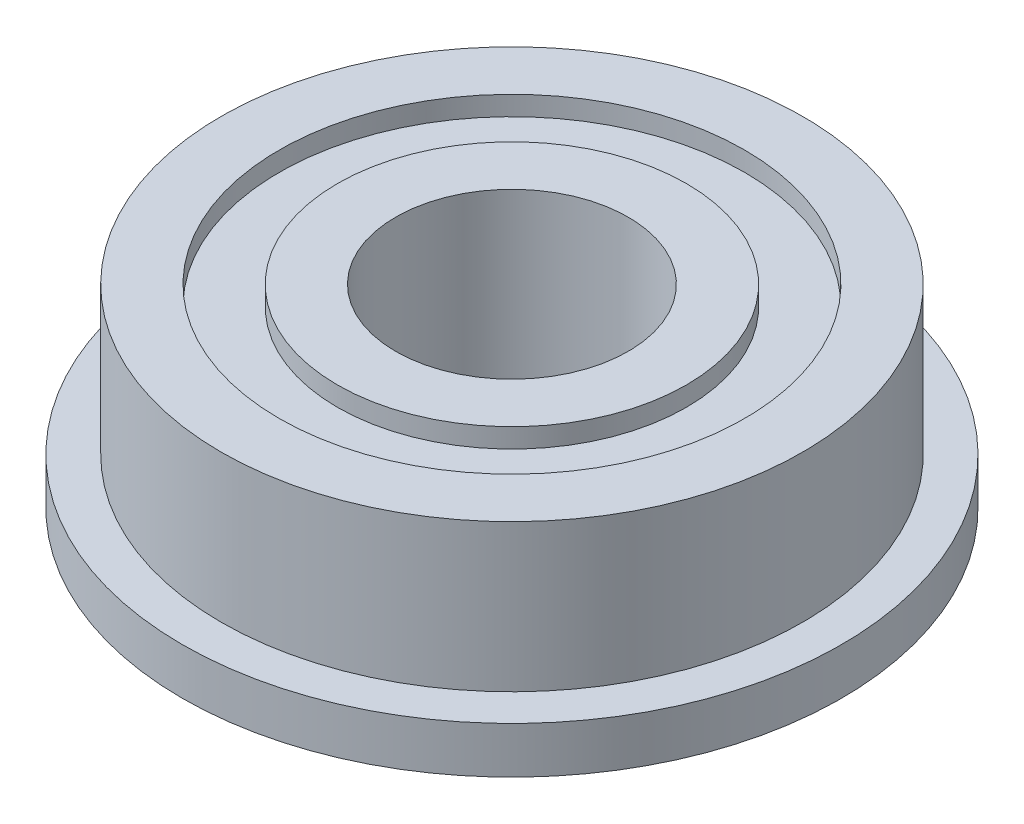
ISO-10303-21;
HEADER;
FILE_DESCRIPTION(('STEP AP214'),'2;1');
FILE_NAME('part.step','',(''),(''),'','','');
FILE_SCHEMA(('AUTOMOTIVE_DESIGN { 1 0 10303 214 1 1 1 1 }'));
ENDSEC;
DATA;
#1=APPLICATION_CONTEXT('core data for automotive mechanical design processes');
#2=APPLICATION_PROTOCOL_DEFINITION('international standard','automotive_design',2000,#1);
#3=PRODUCT_CONTEXT('',#1,'mechanical');
#4=PRODUCT('Part','Part','',(#3));
#5=PRODUCT_RELATED_PRODUCT_CATEGORY('part','',(#4));
#6=PRODUCT_DEFINITION_FORMATION('','',#4);
#7=PRODUCT_DEFINITION_CONTEXT('part definition',#1,'design');
#8=PRODUCT_DEFINITION('design','',#6,#7);
#9=PRODUCT_DEFINITION_SHAPE('','',#8);
#10=(LENGTH_UNIT() NAMED_UNIT(*) SI_UNIT(.MILLI.,.METRE.));
#11=(NAMED_UNIT(*) PLANE_ANGLE_UNIT() SI_UNIT($,.RADIAN.));
#12=(NAMED_UNIT(*) SI_UNIT($,.STERADIAN.) SOLID_ANGLE_UNIT());
#13=UNCERTAINTY_MEASURE_WITH_UNIT(LENGTH_MEASURE(1.E-05),#10,'distance_accuracy_value','');
#14=(GEOMETRIC_REPRESENTATION_CONTEXT(3) GLOBAL_UNCERTAINTY_ASSIGNED_CONTEXT((#13)) GLOBAL_UNIT_ASSIGNED_CONTEXT((#10,
#11,#12)) REPRESENTATION_CONTEXT('',''));
#15=CARTESIAN_POINT('',(0.,0.,0.));
#16=DIRECTION('',(0.,0.,1.));
#17=DIRECTION('',(1.,0.,0.));
#18=AXIS2_PLACEMENT_3D('',#15,#16,#17);
#19=CARTESIAN_POINT('',(4.5,0.,0.));
#20=DIRECTION('',(0.,1.,0.));
#21=DIRECTION('',(0.,0.,1.));
#22=AXIS2_PLACEMENT_3D('',#19,#20,#21);
#23=PLANE('',#22);
#24=CARTESIAN_POINT('',(0.,0.,0.));
#25=DIRECTION('',(0.,1.,0.));
#26=DIRECTION('',(0.,0.,1.));
#27=AXIS2_PLACEMENT_3D('',#24,#25,#26);
#28=CIRCLE('',#27,4.5);
#29=CARTESIAN_POINT('',(0.,0.,4.5));
#30=VERTEX_POINT('',#29);
#31=EDGE_CURVE('E98',#30,#30,#28,.T.);
#32=ORIENTED_EDGE('',*,*,#31,.F.);
#33=EDGE_LOOP('',(#32));
#34=FACE_BOUND('',#33,.T.);
#35=CARTESIAN_POINT('',(0.,0.,0.));
#36=DIRECTION('',(0.,1.,0.));
#37=DIRECTION('',(0.,0.,1.));
#38=AXIS2_PLACEMENT_3D('',#35,#36,#37);
#39=CIRCLE('',#38,3.);
#40=CARTESIAN_POINT('',(0.,0.,3.));
#41=VERTEX_POINT('',#40);
#42=EDGE_CURVE('E10',#41,#41,#39,.T.);
#43=ORIENTED_EDGE('',*,*,#42,.T.);
#44=EDGE_LOOP('',(#43));
#45=FACE_BOUND('',#44,.T.);
#46=ADVANCED_FACE('F39',(#34,#45),#23,.F.);
#47=CARTESIAN_POINT('',(0.,7.20943293874291,0.));
#48=DIRECTION('',(0.,1.,0.));
#49=DIRECTION('',(0.,0.,1.));
#50=AXIS2_PLACEMENT_3D('',#47,#48,#49);
#51=CYLINDRICAL_SURFACE('',#50,3.);
#52=ORIENTED_EDGE('',*,*,#42,.F.);
#53=EDGE_LOOP('',(#52));
#54=FACE_BOUND('',#53,.T.);
#55=CARTESIAN_POINT('',(0.,5.,0.));
#56=DIRECTION('',(0.,1.,0.));
#57=DIRECTION('',(0.,0.,1.));
#58=AXIS2_PLACEMENT_3D('',#55,#56,#57);
#59=CIRCLE('',#58,3.);
#60=CARTESIAN_POINT('',(0.,5.,3.));
#61=VERTEX_POINT('',#60);
#62=EDGE_CURVE('E46',#61,#61,#59,.T.);
#63=ORIENTED_EDGE('',*,*,#62,.T.);
#64=EDGE_LOOP('',(#63));
#65=FACE_BOUND('',#64,.T.);
#66=ADVANCED_FACE('F106',(#54,#65),#51,.F.);
#67=CARTESIAN_POINT('',(3.,5.,0.));
#68=DIRECTION('',(0.,-1.,0.));
#69=DIRECTION('',(0.,0.,-1.));
#70=AXIS2_PLACEMENT_3D('',#67,#68,#69);
#71=PLANE('',#70);
#72=ORIENTED_EDGE('',*,*,#62,.F.);
#73=EDGE_LOOP('',(#72));
#74=FACE_BOUND('',#73,.T.);
#75=CARTESIAN_POINT('',(0.,5.,0.));
#76=DIRECTION('',(0.,1.,0.));
#77=DIRECTION('',(0.,0.,1.));
#78=AXIS2_PLACEMENT_3D('',#75,#76,#77);
#79=CIRCLE('',#78,4.5);
#80=CARTESIAN_POINT('',(0.,5.,4.5));
#81=VERTEX_POINT('',#80);
#82=EDGE_CURVE('E51',#81,#81,#79,.T.);
#83=ORIENTED_EDGE('',*,*,#82,.T.);
#84=EDGE_LOOP('',(#83));
#85=FACE_BOUND('',#84,.T.);
#86=ADVANCED_FACE('F110',(#74,#85),#71,.F.);
#87=CARTESIAN_POINT('',(0.,7.20943293874291,0.));
#88=DIRECTION('',(0.,1.,0.));
#89=DIRECTION('',(0.,0.,1.));
#90=AXIS2_PLACEMENT_3D('',#87,#88,#89);
#91=CYLINDRICAL_SURFACE('',#90,4.5);
#92=ORIENTED_EDGE('',*,*,#82,.F.);
#93=EDGE_LOOP('',(#92));
#94=FACE_BOUND('',#93,.T.);
#95=CARTESIAN_POINT('',(0.,4.5,0.));
#96=DIRECTION('',(0.,1.,0.));
#97=DIRECTION('',(0.,0.,1.));
#98=AXIS2_PLACEMENT_3D('',#95,#96,#97);
#99=CIRCLE('',#98,4.5);
#100=CARTESIAN_POINT('',(0.,4.5,4.5));
#101=VERTEX_POINT('',#100);
#102=EDGE_CURVE('E56',#101,#101,#99,.T.);
#103=ORIENTED_EDGE('',*,*,#102,.T.);
#104=EDGE_LOOP('',(#103));
#105=FACE_BOUND('',#104,.T.);
#106=ADVANCED_FACE('F115',(#94,#105),#91,.T.);
#107=CARTESIAN_POINT('',(4.5,4.5,0.));
#108=DIRECTION('',(0.,-1.,0.));
#109=DIRECTION('',(0.,0.,-1.));
#110=AXIS2_PLACEMENT_3D('',#107,#108,#109);
#111=PLANE('',#110);
#112=ORIENTED_EDGE('',*,*,#102,.F.);
#113=EDGE_LOOP('',(#112));
#114=FACE_BOUND('',#113,.T.);
#115=CARTESIAN_POINT('',(0.,4.5,0.));
#116=DIRECTION('',(0.,1.,0.));
#117=DIRECTION('',(0.,0.,1.));
#118=AXIS2_PLACEMENT_3D('',#115,#116,#117);
#119=CIRCLE('',#118,6.);
#120=CARTESIAN_POINT('',(0.,4.5,6.));
#121=VERTEX_POINT('',#120);
#122=EDGE_CURVE('E62',#121,#121,#119,.T.);
#123=ORIENTED_EDGE('',*,*,#122,.T.);
#124=EDGE_LOOP('',(#123));
#125=FACE_BOUND('',#124,.T.);
#126=ADVANCED_FACE('F121',(#114,#125),#111,.F.);
#127=CARTESIAN_POINT('',(0.,7.20943293874291,0.));
#128=DIRECTION('',(0.,1.,0.));
#129=DIRECTION('',(0.,0.,1.));
#130=AXIS2_PLACEMENT_3D('',#127,#128,#129);
#131=CYLINDRICAL_SURFACE('',#130,6.);
#132=ORIENTED_EDGE('',*,*,#122,.F.);
#133=EDGE_LOOP('',(#132));
#134=FACE_BOUND('',#133,.T.);
#135=CARTESIAN_POINT('',(0.,5.,0.));
#136=DIRECTION('',(0.,1.,0.));
#137=DIRECTION('',(0.,0.,1.));
#138=AXIS2_PLACEMENT_3D('',#135,#136,#137);
#139=CIRCLE('',#138,6.);
#140=CARTESIAN_POINT('',(0.,5.,6.));
#141=VERTEX_POINT('',#140);
#142=EDGE_CURVE('E66',#141,#141,#139,.T.);
#143=ORIENTED_EDGE('',*,*,#142,.T.);
#144=EDGE_LOOP('',(#143));
#145=FACE_BOUND('',#144,.T.);
#146=ADVANCED_FACE('F125',(#134,#145),#131,.F.);
#147=CARTESIAN_POINT('',(6.,5.,0.));
#148=DIRECTION('',(0.,-1.,0.));
#149=DIRECTION('',(0.,0.,-1.));
#150=AXIS2_PLACEMENT_3D('',#147,#148,#149);
#151=PLANE('',#150);
#152=ORIENTED_EDGE('',*,*,#142,.F.);
#153=EDGE_LOOP('',(#152));
#154=FACE_BOUND('',#153,.T.);
#155=CARTESIAN_POINT('',(0.,5.,0.));
#156=DIRECTION('',(0.,1.,0.));
#157=DIRECTION('',(0.,0.,1.));
#158=AXIS2_PLACEMENT_3D('',#155,#156,#157);
#159=CIRCLE('',#158,7.5);
#160=CARTESIAN_POINT('',(0.,5.,7.5));
#161=VERTEX_POINT('',#160);
#162=EDGE_CURVE('E70',#161,#161,#159,.T.);
#163=ORIENTED_EDGE('',*,*,#162,.T.);
#164=EDGE_LOOP('',(#163));
#165=FACE_BOUND('',#164,.T.);
#166=ADVANCED_FACE('F129',(#154,#165),#151,.F.);
#167=CARTESIAN_POINT('',(0.,7.20943293874291,0.));
#168=DIRECTION('',(0.,1.,0.));
#169=DIRECTION('',(0.,0.,1.));
#170=AXIS2_PLACEMENT_3D('',#167,#168,#169);
#171=CYLINDRICAL_SURFACE('',#170,7.5);
#172=ORIENTED_EDGE('',*,*,#162,.F.);
#173=EDGE_LOOP('',(#172));
#174=FACE_BOUND('',#173,.T.);
#175=CARTESIAN_POINT('',(0.,1.2,0.));
#176=DIRECTION('',(0.,1.,0.));
#177=DIRECTION('',(0.,0.,1.));
#178=AXIS2_PLACEMENT_3D('',#175,#176,#177);
#179=CIRCLE('',#178,7.5);
#180=CARTESIAN_POINT('',(0.,1.2,7.5));
#181=VERTEX_POINT('',#180);
#182=EDGE_CURVE('E74',#181,#181,#179,.T.);
#183=ORIENTED_EDGE('',*,*,#182,.T.);
#184=EDGE_LOOP('',(#183));
#185=FACE_BOUND('',#184,.T.);
#186=ADVANCED_FACE('F133',(#174,#185),#171,.T.);
#187=CARTESIAN_POINT('',(7.5,1.2,0.));
#188=DIRECTION('',(0.,-1.,0.));
#189=DIRECTION('',(0.,0.,-1.));
#190=AXIS2_PLACEMENT_3D('',#187,#188,#189);
#191=PLANE('',#190);
#192=ORIENTED_EDGE('',*,*,#182,.F.);
#193=EDGE_LOOP('',(#192));
#194=FACE_BOUND('',#193,.T.);
#195=CARTESIAN_POINT('',(0.,1.2,0.));
#196=DIRECTION('',(0.,1.,0.));
#197=DIRECTION('',(0.,0.,1.));
#198=AXIS2_PLACEMENT_3D('',#195,#196,#197);
#199=CIRCLE('',#198,8.5);
#200=CARTESIAN_POINT('',(0.,1.2,8.5));
#201=VERTEX_POINT('',#200);
#202=EDGE_CURVE('E78',#201,#201,#199,.T.);
#203=ORIENTED_EDGE('',*,*,#202,.T.);
#204=EDGE_LOOP('',(#203));
#205=FACE_BOUND('',#204,.T.);
#206=ADVANCED_FACE('F137',(#194,#205),#191,.F.);
#207=CARTESIAN_POINT('',(0.,7.20943293874291,0.));
#208=DIRECTION('',(0.,1.,0.));
#209=DIRECTION('',(0.,0.,1.));
#210=AXIS2_PLACEMENT_3D('',#207,#208,#209);
#211=CYLINDRICAL_SURFACE('',#210,8.5);
#212=ORIENTED_EDGE('',*,*,#202,.F.);
#213=EDGE_LOOP('',(#212));
#214=FACE_BOUND('',#213,.T.);
#215=CARTESIAN_POINT('',(0.,0.,0.));
#216=DIRECTION('',(0.,1.,0.));
#217=DIRECTION('',(0.,0.,1.));
#218=AXIS2_PLACEMENT_3D('',#215,#216,#217);
#219=CIRCLE('',#218,8.5);
#220=CARTESIAN_POINT('',(0.,0.,8.5));
#221=VERTEX_POINT('',#220);
#222=EDGE_CURVE('E82',#221,#221,#219,.T.);
#223=ORIENTED_EDGE('',*,*,#222,.T.);
#224=EDGE_LOOP('',(#223));
#225=FACE_BOUND('',#224,.T.);
#226=ADVANCED_FACE('F141',(#214,#225),#211,.T.);
#227=CARTESIAN_POINT('',(8.5,0.,0.));
#228=DIRECTION('',(0.,1.,0.));
#229=DIRECTION('',(0.,0.,1.));
#230=AXIS2_PLACEMENT_3D('',#227,#228,#229);
#231=PLANE('',#230);
#232=ORIENTED_EDGE('',*,*,#222,.F.);
#233=EDGE_LOOP('',(#232));
#234=FACE_BOUND('',#233,.T.);
#235=CARTESIAN_POINT('',(0.,0.,0.));
#236=DIRECTION('',(0.,1.,0.));
#237=DIRECTION('',(0.,0.,1.));
#238=AXIS2_PLACEMENT_3D('',#235,#236,#237);
#239=CIRCLE('',#238,6.);
#240=CARTESIAN_POINT('',(0.,0.,6.));
#241=VERTEX_POINT('',#240);
#242=EDGE_CURVE('E86',#241,#241,#239,.T.);
#243=ORIENTED_EDGE('',*,*,#242,.T.);
#244=EDGE_LOOP('',(#243));
#245=FACE_BOUND('',#244,.T.);
#246=ADVANCED_FACE('F145',(#234,#245),#231,.F.);
#247=CARTESIAN_POINT('',(0.,7.20943293874291,0.));
#248=DIRECTION('',(0.,1.,0.));
#249=DIRECTION('',(0.,0.,1.));
#250=AXIS2_PLACEMENT_3D('',#247,#248,#249);
#251=CYLINDRICAL_SURFACE('',#250,6.);
#252=ORIENTED_EDGE('',*,*,#242,.F.);
#253=EDGE_LOOP('',(#252));
#254=FACE_BOUND('',#253,.T.);
#255=CARTESIAN_POINT('',(0.,0.5,0.));
#256=DIRECTION('',(0.,1.,0.));
#257=DIRECTION('',(0.,0.,1.));
#258=AXIS2_PLACEMENT_3D('',#255,#256,#257);
#259=CIRCLE('',#258,6.);
#260=CARTESIAN_POINT('',(0.,0.5,6.));
#261=VERTEX_POINT('',#260);
#262=EDGE_CURVE('E90',#261,#261,#259,.T.);
#263=ORIENTED_EDGE('',*,*,#262,.T.);
#264=EDGE_LOOP('',(#263));
#265=FACE_BOUND('',#264,.T.);
#266=ADVANCED_FACE('F149',(#254,#265),#251,.F.);
#267=CARTESIAN_POINT('',(6.,0.5,0.));
#268=DIRECTION('',(0.,1.,0.));
#269=DIRECTION('',(0.,0.,1.));
#270=AXIS2_PLACEMENT_3D('',#267,#268,#269);
#271=PLANE('',#270);
#272=ORIENTED_EDGE('',*,*,#262,.F.);
#273=EDGE_LOOP('',(#272));
#274=FACE_BOUND('',#273,.T.);
#275=CARTESIAN_POINT('',(0.,0.5,0.));
#276=DIRECTION('',(0.,1.,0.));
#277=DIRECTION('',(0.,0.,1.));
#278=AXIS2_PLACEMENT_3D('',#275,#276,#277);
#279=CIRCLE('',#278,4.5);
#280=CARTESIAN_POINT('',(0.,0.5,4.5));
#281=VERTEX_POINT('',#280);
#282=EDGE_CURVE('E94',#281,#281,#279,.T.);
#283=ORIENTED_EDGE('',*,*,#282,.T.);
#284=EDGE_LOOP('',(#283));
#285=FACE_BOUND('',#284,.T.);
#286=ADVANCED_FACE('F153',(#274,#285),#271,.F.);
#287=CARTESIAN_POINT('',(0.,7.20943293874291,0.));
#288=DIRECTION('',(0.,1.,0.));
#289=DIRECTION('',(0.,0.,1.));
#290=AXIS2_PLACEMENT_3D('',#287,#288,#289);
#291=CYLINDRICAL_SURFACE('',#290,4.5);
#292=ORIENTED_EDGE('',*,*,#282,.F.);
#293=EDGE_LOOP('',(#292));
#294=FACE_BOUND('',#293,.T.);
#295=ORIENTED_EDGE('',*,*,#31,.T.);
#296=EDGE_LOOP('',(#295));
#297=FACE_BOUND('',#296,.T.);
#298=ADVANCED_FACE('F103',(#294,#297),#291,.T.);
#299=CLOSED_SHELL('',(#46,#66,#86,#106,#126,#146,#166,#186,#206,#226,#246,#266,#286,#298));
#300=MANIFOLD_SOLID_BREP('B2',#299);
#301=ADVANCED_BREP_SHAPE_REPRESENTATION('',(#18,#300),#14);
#302=SHAPE_DEFINITION_REPRESENTATION(#9,#301);
ENDSEC;
END-ISO-10303-21;
